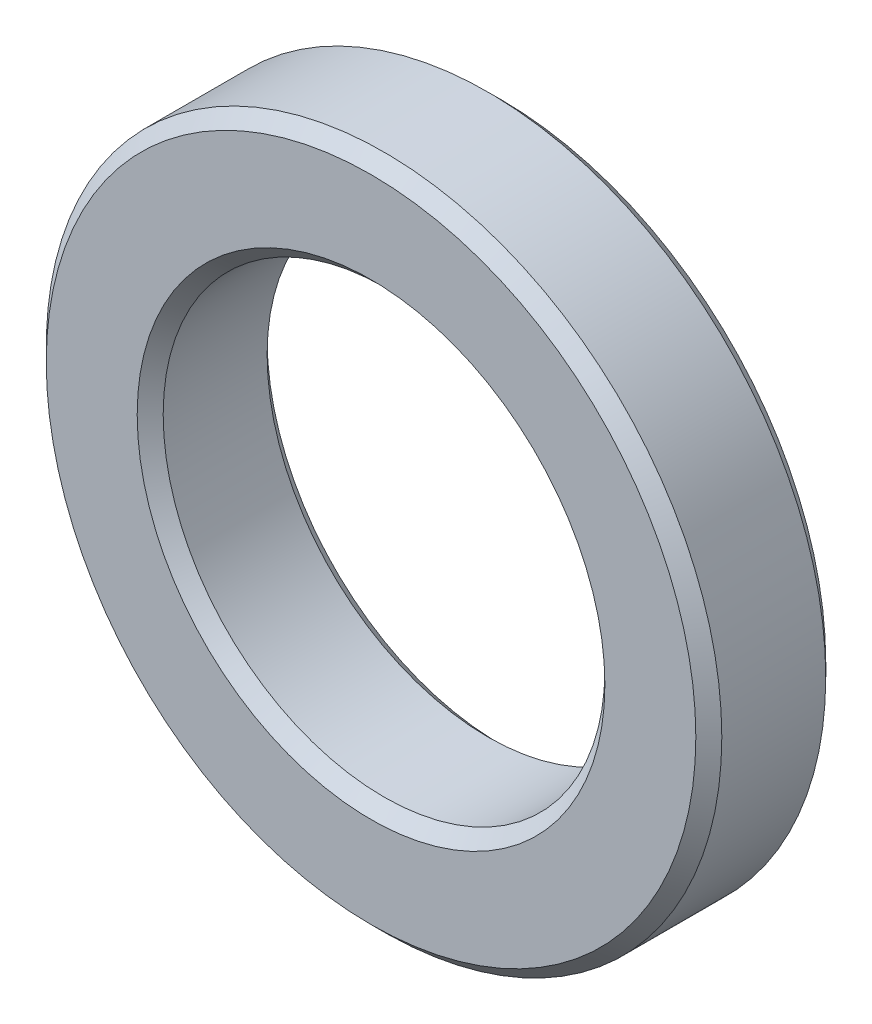
ISO-10303-21;
HEADER;
FILE_DESCRIPTION(('STEP AP214'),'2;1');
FILE_NAME('part.step','',(''),(''),'','','');
FILE_SCHEMA(('AUTOMOTIVE_DESIGN { 1 0 10303 214 1 1 1 1 }'));
ENDSEC;
DATA;
#1=APPLICATION_CONTEXT('core data for automotive mechanical design processes');
#2=APPLICATION_PROTOCOL_DEFINITION('international standard','automotive_design',2000,#1);
#3=PRODUCT_CONTEXT('',#1,'mechanical');
#4=PRODUCT('Part','Part','',(#3));
#5=PRODUCT_RELATED_PRODUCT_CATEGORY('part','',(#4));
#6=PRODUCT_DEFINITION_FORMATION('','',#4);
#7=PRODUCT_DEFINITION_CONTEXT('part definition',#1,'design');
#8=PRODUCT_DEFINITION('design','',#6,#7);
#9=PRODUCT_DEFINITION_SHAPE('','',#8);
#10=(LENGTH_UNIT() NAMED_UNIT(*) SI_UNIT(.MILLI.,.METRE.));
#11=(NAMED_UNIT(*) PLANE_ANGLE_UNIT() SI_UNIT($,.RADIAN.));
#12=(NAMED_UNIT(*) SI_UNIT($,.STERADIAN.) SOLID_ANGLE_UNIT());
#13=UNCERTAINTY_MEASURE_WITH_UNIT(LENGTH_MEASURE(1.E-05),#10,'distance_accuracy_value','');
#14=(GEOMETRIC_REPRESENTATION_CONTEXT(3) GLOBAL_UNCERTAINTY_ASSIGNED_CONTEXT((#13)) GLOBAL_UNIT_ASSIGNED_CONTEXT((#10,
#11,#12)) REPRESENTATION_CONTEXT('',''));
#15=CARTESIAN_POINT('',(0.,0.,0.));
#16=DIRECTION('',(0.,0.,1.));
#17=DIRECTION('',(1.,0.,0.));
#18=AXIS2_PLACEMENT_3D('',#15,#16,#17);
#19=CARTESIAN_POINT('',(0.,0.,5.));
#20=DIRECTION('',(0.,0.,1.));
#21=DIRECTION('',(1.,0.,0.));
#22=AXIS2_PLACEMENT_3D('',#19,#20,#21);
#23=PLANE('',#22);
#24=CARTESIAN_POINT('',(0.,0.,5.));
#25=DIRECTION('',(0.,0.,1.));
#26=DIRECTION('',(1.,0.,0.));
#27=AXIS2_PLACEMENT_3D('',#24,#25,#26);
#28=CIRCLE('',#27,9.00000000000001);
#29=CARTESIAN_POINT('',(9.00000000000001,0.,5.));
#30=VERTEX_POINT('',#29);
#31=EDGE_CURVE('E10',#30,#30,#28,.F.);
#32=ORIENTED_EDGE('',*,*,#31,.T.);
#33=EDGE_LOOP('',(#32));
#34=FACE_BOUND('',#33,.T.);
#35=CARTESIAN_POINT('',(0.,0.,5.));
#36=DIRECTION('',(0.,0.,1.));
#37=DIRECTION('',(1.,0.,0.));
#38=AXIS2_PLACEMENT_3D('',#35,#36,#37);
#39=CIRCLE('',#38,12.5);
#40=CARTESIAN_POINT('',(12.5,0.,5.));
#41=VERTEX_POINT('',#40);
#42=EDGE_CURVE('E42',#41,#41,#39,.T.);
#43=ORIENTED_EDGE('',*,*,#42,.T.);
#44=EDGE_LOOP('',(#43));
#45=FACE_BOUND('',#44,.T.);
#46=ADVANCED_FACE('F34',(#34,#45),#23,.T.);
#47=CARTESIAN_POINT('',(0.,0.,0.));
#48=DIRECTION('',(0.,0.,1.));
#49=DIRECTION('',(1.,0.,0.));
#50=AXIS2_PLACEMENT_3D('',#47,#48,#49);
#51=PLANE('',#50);
#52=CARTESIAN_POINT('',(0.,0.,0.));
#53=DIRECTION('',(0.,0.,1.));
#54=DIRECTION('',(1.,0.,0.));
#55=AXIS2_PLACEMENT_3D('',#52,#53,#54);
#56=CIRCLE('',#55,9.);
#57=CARTESIAN_POINT('',(9.,0.,0.));
#58=VERTEX_POINT('',#57);
#59=EDGE_CURVE('E61',#58,#58,#56,.T.);
#60=ORIENTED_EDGE('',*,*,#59,.T.);
#61=EDGE_LOOP('',(#60));
#62=FACE_BOUND('',#61,.T.);
#63=CARTESIAN_POINT('',(0.,0.,0.));
#64=DIRECTION('',(0.,0.,1.));
#65=DIRECTION('',(1.,0.,0.));
#66=AXIS2_PLACEMENT_3D('',#63,#64,#65);
#67=CIRCLE('',#66,12.5);
#68=CARTESIAN_POINT('',(12.5,0.,0.));
#69=VERTEX_POINT('',#68);
#70=EDGE_CURVE('E64',#69,#69,#67,.F.);
#71=ORIENTED_EDGE('',*,*,#70,.T.);
#72=EDGE_LOOP('',(#71));
#73=FACE_BOUND('',#72,.T.);
#74=ADVANCED_FACE('F68',(#62,#73),#51,.F.);
#75=CARTESIAN_POINT('',(0.,0.,5.));
#76=DIRECTION('',(0.,0.,-1.));
#77=DIRECTION('',(-1.,0.,0.));
#78=AXIS2_PLACEMENT_3D('',#75,#76,#77);
#79=CYLINDRICAL_SURFACE('',#78,13.);
#80=CARTESIAN_POINT('',(0.,0.,0.500000000000006));
#81=DIRECTION('',(0.,0.,1.));
#82=DIRECTION('',(1.,0.,0.));
#83=AXIS2_PLACEMENT_3D('',#80,#81,#82);
#84=CIRCLE('',#83,13.);
#85=CARTESIAN_POINT('',(13.,0.,0.500000000000006));
#86=VERTEX_POINT('',#85);
#87=EDGE_CURVE('E46',#86,#86,#84,.T.);
#88=ORIENTED_EDGE('',*,*,#87,.T.);
#89=EDGE_LOOP('',(#88));
#90=FACE_BOUND('',#89,.T.);
#91=CARTESIAN_POINT('',(0.,0.,4.5));
#92=DIRECTION('',(0.,0.,1.));
#93=DIRECTION('',(1.,0.,0.));
#94=AXIS2_PLACEMENT_3D('',#91,#92,#93);
#95=CIRCLE('',#94,13.);
#96=CARTESIAN_POINT('',(13.,0.,4.5));
#97=VERTEX_POINT('',#96);
#98=EDGE_CURVE('E50',#97,#97,#95,.F.);
#99=ORIENTED_EDGE('',*,*,#98,.T.);
#100=EDGE_LOOP('',(#99));
#101=FACE_BOUND('',#100,.T.);
#102=ADVANCED_FACE('F78',(#90,#101),#79,.T.);
#103=CARTESIAN_POINT('',(0.,0.,5.));
#104=DIRECTION('',(0.,0.,-1.));
#105=DIRECTION('',(-1.,0.,0.));
#106=AXIS2_PLACEMENT_3D('',#103,#104,#105);
#107=CYLINDRICAL_SURFACE('',#106,8.5);
#108=CARTESIAN_POINT('',(0.,0.,0.500000000000004));
#109=DIRECTION('',(0.,0.,1.));
#110=DIRECTION('',(1.,0.,0.));
#111=AXIS2_PLACEMENT_3D('',#108,#109,#110);
#112=CIRCLE('',#111,8.5);
#113=CARTESIAN_POINT('',(8.5,0.,0.500000000000004));
#114=VERTEX_POINT('',#113);
#115=EDGE_CURVE('E55',#114,#114,#112,.F.);
#116=ORIENTED_EDGE('',*,*,#115,.T.);
#117=EDGE_LOOP('',(#116));
#118=FACE_BOUND('',#117,.T.);
#119=CARTESIAN_POINT('',(0.,0.,4.5));
#120=DIRECTION('',(0.,0.,1.));
#121=DIRECTION('',(1.,0.,0.));
#122=AXIS2_PLACEMENT_3D('',#119,#120,#121);
#123=CIRCLE('',#122,8.5);
#124=CARTESIAN_POINT('',(8.5,0.,4.5));
#125=VERTEX_POINT('',#124);
#126=EDGE_CURVE('E58',#125,#125,#123,.T.);
#127=ORIENTED_EDGE('',*,*,#126,.T.);
#128=EDGE_LOOP('',(#127));
#129=FACE_BOUND('',#128,.T.);
#130=ADVANCED_FACE('F81',(#118,#129),#107,.F.);
#131=CARTESIAN_POINT('',(0.,0.,0.));
#132=DIRECTION('',(0.,0.,-1.));
#133=DIRECTION('',(-1.,0.,0.));
#134=AXIS2_PLACEMENT_3D('',#131,#132,#133);
#135=CONICAL_SURFACE('',#134,9.,0.785398163397443);
#136=ORIENTED_EDGE('',*,*,#115,.F.);
#137=EDGE_LOOP('',(#136));
#138=FACE_BOUND('',#137,.T.);
#139=ORIENTED_EDGE('',*,*,#59,.F.);
#140=EDGE_LOOP('',(#139));
#141=FACE_BOUND('',#140,.T.);
#142=ADVANCED_FACE('F74',(#138,#141),#135,.F.);
#143=CARTESIAN_POINT('',(0.,0.,0.500000000000006));
#144=DIRECTION('',(0.,0.,1.));
#145=DIRECTION('',(1.,0.,0.));
#146=AXIS2_PLACEMENT_3D('',#143,#144,#145);
#147=CONICAL_SURFACE('',#146,13.,0.78539816339745);
#148=ORIENTED_EDGE('',*,*,#70,.F.);
#149=EDGE_LOOP('',(#148));
#150=FACE_BOUND('',#149,.T.);
#151=ORIENTED_EDGE('',*,*,#87,.F.);
#152=EDGE_LOOP('',(#151));
#153=FACE_BOUND('',#152,.T.);
#154=ADVANCED_FACE('F70',(#150,#153),#147,.T.);
#155=CARTESIAN_POINT('',(0.,0.,4.5));
#156=DIRECTION('',(0.,0.,1.));
#157=DIRECTION('',(1.,0.,0.));
#158=AXIS2_PLACEMENT_3D('',#155,#156,#157);
#159=CONICAL_SURFACE('',#158,8.5,0.785398163397454);
#160=ORIENTED_EDGE('',*,*,#31,.F.);
#161=EDGE_LOOP('',(#160));
#162=FACE_BOUND('',#161,.T.);
#163=ORIENTED_EDGE('',*,*,#126,.F.);
#164=EDGE_LOOP('',(#163));
#165=FACE_BOUND('',#164,.T.);
#166=ADVANCED_FACE('F73',(#162,#165),#159,.F.);
#167=CARTESIAN_POINT('',(0.,0.,5.));
#168=DIRECTION('',(0.,0.,-1.));
#169=DIRECTION('',(-1.,0.,0.));
#170=AXIS2_PLACEMENT_3D('',#167,#168,#169);
#171=CONICAL_SURFACE('',#170,12.5,0.785398163397441);
#172=ORIENTED_EDGE('',*,*,#98,.F.);
#173=EDGE_LOOP('',(#172));
#174=FACE_BOUND('',#173,.T.);
#175=ORIENTED_EDGE('',*,*,#42,.F.);
#176=EDGE_LOOP('',(#175));
#177=FACE_BOUND('',#176,.T.);
#178=ADVANCED_FACE('F37',(#174,#177),#171,.T.);
#179=CLOSED_SHELL('',(#46,#74,#102,#130,#142,#154,#166,#178));
#180=MANIFOLD_SOLID_BREP('B2',#179);
#181=ADVANCED_BREP_SHAPE_REPRESENTATION('',(#18,#180),#14);
#182=SHAPE_DEFINITION_REPRESENTATION(#9,#181);
ENDSEC;
END-ISO-10303-21;
